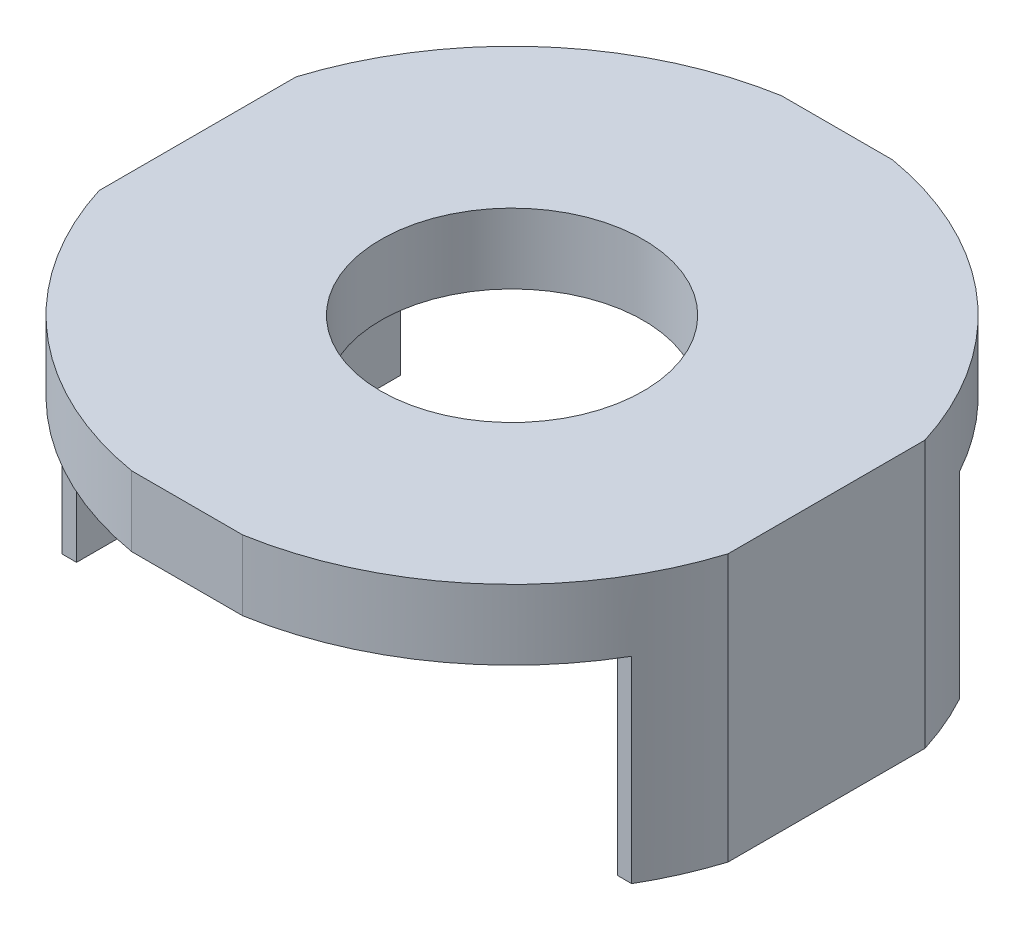
ISO-10303-21;
HEADER;
FILE_DESCRIPTION(('STEP AP214'),'2;1');
FILE_NAME('part.step','',(''),(''),'','','');
FILE_SCHEMA(('AUTOMOTIVE_DESIGN { 1 0 10303 214 1 1 1 1 }'));
ENDSEC;
DATA;
#1=APPLICATION_CONTEXT('core data for automotive mechanical design processes');
#2=APPLICATION_PROTOCOL_DEFINITION('international standard','automotive_design',2000,#1);
#3=PRODUCT_CONTEXT('',#1,'mechanical');
#4=PRODUCT('Part','Part','',(#3));
#5=PRODUCT_RELATED_PRODUCT_CATEGORY('part','',(#4));
#6=PRODUCT_DEFINITION_FORMATION('','',#4);
#7=PRODUCT_DEFINITION_CONTEXT('part definition',#1,'design');
#8=PRODUCT_DEFINITION('design','',#6,#7);
#9=PRODUCT_DEFINITION_SHAPE('','',#8);
#10=(LENGTH_UNIT() NAMED_UNIT(*) SI_UNIT(.MILLI.,.METRE.));
#11=(NAMED_UNIT(*) PLANE_ANGLE_UNIT() SI_UNIT($,.RADIAN.));
#12=(NAMED_UNIT(*) SI_UNIT($,.STERADIAN.) SOLID_ANGLE_UNIT());
#13=UNCERTAINTY_MEASURE_WITH_UNIT(LENGTH_MEASURE(1.E-05),#10,'distance_accuracy_value','');
#14=(GEOMETRIC_REPRESENTATION_CONTEXT(3) GLOBAL_UNCERTAINTY_ASSIGNED_CONTEXT((#13)) GLOBAL_UNIT_ASSIGNED_CONTEXT((#10,
#11,#12)) REPRESENTATION_CONTEXT('',''));
#15=CARTESIAN_POINT('',(0.,0.,0.));
#16=DIRECTION('',(0.,0.,1.));
#17=DIRECTION('',(1.,0.,0.));
#18=AXIS2_PLACEMENT_3D('',#15,#16,#17);
#19=CARTESIAN_POINT('',(0.,0.,0.));
#20=DIRECTION('',(0.,1.,0.));
#21=DIRECTION('',(0.,0.,1.));
#22=AXIS2_PLACEMENT_3D('',#19,#20,#21);
#23=PLANE('',#22);
#24=CARTESIAN_POINT('',(0.,0.,0.));
#25=DIRECTION('',(0.,1.,0.));
#26=DIRECTION('',(0.,0.,1.));
#27=AXIS2_PLACEMENT_3D('',#24,#25,#26);
#28=CIRCLE('',#27,3.);
#29=CARTESIAN_POINT('',(0.,0.,3.));
#30=VERTEX_POINT('',#29);
#31=EDGE_CURVE('E195',#30,#30,#28,.T.);
#32=ORIENTED_EDGE('',*,*,#31,.T.);
#33=EDGE_LOOP('',(#32));
#34=FACE_BOUND('',#33,.T.);
#35=DIRECTION('',(1.,0.,0.));
#36=VECTOR('',#35,1.);
#37=CARTESIAN_POINT('',(0.,0.,-3.63578831627872));
#38=LINE('',#37,#36);
#39=CARTESIAN_POINT('',(-6.59408396361551,0.,-3.63578831627872));
#40=VERTEX_POINT('',#39);
#41=CARTESIAN_POINT('',(-6.18598636235834,0.,-3.63578831627872));
#42=VERTEX_POINT('',#41);
#43=EDGE_CURVE('E220',#40,#42,#38,.T.);
#44=ORIENTED_EDGE('',*,*,#43,.F.);
#45=CARTESIAN_POINT('',(0.,0.,0.));
#46=DIRECTION('',(0.,1.,0.));
#47=DIRECTION('',(0.,0.,1.));
#48=AXIS2_PLACEMENT_3D('',#45,#46,#47);
#49=CIRCLE('',#48,7.53);
#50=CARTESIAN_POINT('',(-1.26824843861214,0.,-7.42242857142848));
#51=VERTEX_POINT('',#50);
#52=EDGE_CURVE('E141',#51,#40,#49,.T.);
#53=ORIENTED_EDGE('',*,*,#52,.F.);
#54=DIRECTION('',(-1.,0.,0.));
#55=VECTOR('',#54,1.);
#56=CARTESIAN_POINT('',(-1.26824843861214,0.,-7.42242857142848));
#57=LINE('',#56,#55);
#58=CARTESIAN_POINT('',(1.26824843861214,0.,-7.42242857142848));
#59=VERTEX_POINT('',#58);
#60=EDGE_CURVE('E80',#59,#51,#57,.T.);
#61=ORIENTED_EDGE('',*,*,#60,.F.);
#62=CARTESIAN_POINT('',(0.,0.,0.));
#63=DIRECTION('',(0.,1.,0.));
#64=DIRECTION('',(0.,0.,1.));
#65=AXIS2_PLACEMENT_3D('',#62,#63,#64);
#66=CIRCLE('',#65,7.53);
#67=CARTESIAN_POINT('',(6.60275837824071,0.,-3.62001129812769));
#68=VERTEX_POINT('',#67);
#69=EDGE_CURVE('E138',#68,#59,#66,.T.);
#70=ORIENTED_EDGE('',*,*,#69,.F.);
#71=DIRECTION('',(1.,0.,0.));
#72=VECTOR('',#71,1.);
#73=CARTESIAN_POINT('',(0.,0.,-3.62001129812769));
#74=LINE('',#73,#72);
#75=CARTESIAN_POINT('',(6.18598636235834,0.,-3.62001129812769));
#76=VERTEX_POINT('',#75);
#77=EDGE_CURVE('E173',#76,#68,#74,.T.);
#78=ORIENTED_EDGE('',*,*,#77,.F.);
#79=DIRECTION('',(0.,0.,1.));
#80=VECTOR('',#79,1.);
#81=CARTESIAN_POINT('',(6.18598636235834,0.,0.));
#82=LINE('',#81,#80);
#83=CARTESIAN_POINT('',(6.18598636235834,0.,3.77998870187231));
#84=VERTEX_POINT('',#83);
#85=EDGE_CURVE('E168',#76,#84,#82,.T.);
#86=ORIENTED_EDGE('',*,*,#85,.T.);
#87=DIRECTION('',(1.,0.,0.));
#88=VECTOR('',#87,1.);
#89=CARTESIAN_POINT('',(0.,0.,3.77998870187231));
#90=LINE('',#89,#88);
#91=CARTESIAN_POINT('',(6.51249456151156,0.,3.77998870187231));
#92=VERTEX_POINT('',#91);
#93=EDGE_CURVE('E49',#84,#92,#90,.T.);
#94=ORIENTED_EDGE('',*,*,#93,.T.);
#95=CARTESIAN_POINT('',(0.,0.,0.));
#96=DIRECTION('',(0.,1.,0.));
#97=DIRECTION('',(0.,0.,1.));
#98=AXIS2_PLACEMENT_3D('',#95,#96,#97);
#99=CIRCLE('',#98,7.53);
#100=CARTESIAN_POINT('',(1.26824843861214,0.,7.42242857142848));
#101=VERTEX_POINT('',#100);
#102=EDGE_CURVE('E135',#101,#92,#99,.T.);
#103=ORIENTED_EDGE('',*,*,#102,.F.);
#104=DIRECTION('',(1.,0.,0.));
#105=VECTOR('',#104,1.);
#106=CARTESIAN_POINT('',(1.26824843861214,0.,7.42242857142848));
#107=LINE('',#106,#105);
#108=CARTESIAN_POINT('',(-1.26824843861214,0.,7.42242857142848));
#109=VERTEX_POINT('',#108);
#110=EDGE_CURVE('E132',#109,#101,#107,.T.);
#111=ORIENTED_EDGE('',*,*,#110,.F.);
#112=CARTESIAN_POINT('',(0.,0.,0.));
#113=DIRECTION('',(0.,1.,0.));
#114=DIRECTION('',(0.,0.,1.));
#115=AXIS2_PLACEMENT_3D('',#112,#113,#114);
#116=CIRCLE('',#115,7.53);
#117=CARTESIAN_POINT('',(-6.52162636158621,0.,3.76421168372128));
#118=VERTEX_POINT('',#117);
#119=EDGE_CURVE('E130',#118,#109,#116,.T.);
#120=ORIENTED_EDGE('',*,*,#119,.F.);
#121=DIRECTION('',(1.,0.,0.));
#122=VECTOR('',#121,1.);
#123=CARTESIAN_POINT('',(0.,0.,3.76421168372128));
#124=LINE('',#123,#122);
#125=CARTESIAN_POINT('',(-6.18598636235834,0.,3.76421168372128));
#126=VERTEX_POINT('',#125);
#127=EDGE_CURVE('E272',#118,#126,#124,.T.);
#128=ORIENTED_EDGE('',*,*,#127,.T.);
#129=DIRECTION('',(0.,0.,1.));
#130=VECTOR('',#129,1.);
#131=CARTESIAN_POINT('',(-6.18598636235834,0.,0.));
#132=LINE('',#131,#130);
#133=EDGE_CURVE('E276',#42,#126,#132,.T.);
#134=ORIENTED_EDGE('',*,*,#133,.F.);
#135=EDGE_LOOP('',(#44,#53,#61,#70,#78,#86,#94,#103,#111,#120,#128,#134));
#136=FACE_BOUND('',#135,.T.);
#137=ADVANCED_FACE('F34',(#34,#136),#23,.F.);
#138=CARTESIAN_POINT('',(0.,1.6,0.));
#139=DIRECTION('',(0.,1.,0.));
#140=DIRECTION('',(0.,0.,1.));
#141=AXIS2_PLACEMENT_3D('',#138,#139,#140);
#142=PLANE('',#141);
#143=CARTESIAN_POINT('',(0.,1.6,0.));
#144=DIRECTION('',(0.,1.,0.));
#145=DIRECTION('',(0.,0.,1.));
#146=AXIS2_PLACEMENT_3D('',#143,#144,#145);
#147=CIRCLE('',#146,7.53);
#148=CARTESIAN_POINT('',(-7.18598636235834,1.6,2.25));
#149=VERTEX_POINT('',#148);
#150=CARTESIAN_POINT('',(-1.26824843861214,1.6,7.42242857142848));
#151=VERTEX_POINT('',#150);
#152=EDGE_CURVE('E143',#149,#151,#147,.T.);
#153=ORIENTED_EDGE('',*,*,#152,.T.);
#154=DIRECTION('',(1.,0.,0.));
#155=VECTOR('',#154,1.);
#156=CARTESIAN_POINT('',(1.26824843861214,1.6,7.42242857142848));
#157=LINE('',#156,#155);
#158=CARTESIAN_POINT('',(1.26824843861214,1.6,7.42242857142848));
#159=VERTEX_POINT('',#158);
#160=EDGE_CURVE('E88',#151,#159,#157,.T.);
#161=ORIENTED_EDGE('',*,*,#160,.T.);
#162=CARTESIAN_POINT('',(0.,1.6,0.));
#163=DIRECTION('',(0.,1.,0.));
#164=DIRECTION('',(0.,0.,1.));
#165=AXIS2_PLACEMENT_3D('',#162,#163,#164);
#166=CIRCLE('',#165,7.53);
#167=CARTESIAN_POINT('',(7.18598636235834,1.6,2.25));
#168=VERTEX_POINT('',#167);
#169=EDGE_CURVE('E160',#159,#168,#166,.T.);
#170=ORIENTED_EDGE('',*,*,#169,.T.);
#171=DIRECTION('',(0.,0.,-1.));
#172=VECTOR('',#171,1.);
#173=CARTESIAN_POINT('',(7.18598636235834,1.6,2.25));
#174=LINE('',#173,#172);
#175=CARTESIAN_POINT('',(7.18598636235834,1.6,-2.25));
#176=VERTEX_POINT('',#175);
#177=EDGE_CURVE('E203',#168,#176,#174,.T.);
#178=ORIENTED_EDGE('',*,*,#177,.T.);
#179=CARTESIAN_POINT('',(0.,1.6,0.));
#180=DIRECTION('',(0.,1.,0.));
#181=DIRECTION('',(0.,0.,1.));
#182=AXIS2_PLACEMENT_3D('',#179,#180,#181);
#183=CIRCLE('',#182,7.53);
#184=CARTESIAN_POINT('',(1.26824843861214,1.6,-7.42242857142848));
#185=VERTEX_POINT('',#184);
#186=EDGE_CURVE('E111',#176,#185,#183,.T.);
#187=ORIENTED_EDGE('',*,*,#186,.T.);
#188=DIRECTION('',(-1.,0.,0.));
#189=VECTOR('',#188,1.);
#190=CARTESIAN_POINT('',(-1.26824843861214,1.6,-7.42242857142848));
#191=LINE('',#190,#189);
#192=CARTESIAN_POINT('',(-1.26824843861214,1.6,-7.42242857142848));
#193=VERTEX_POINT('',#192);
#194=EDGE_CURVE('E104',#185,#193,#191,.T.);
#195=ORIENTED_EDGE('',*,*,#194,.T.);
#196=CARTESIAN_POINT('',(0.,1.6,0.));
#197=DIRECTION('',(0.,1.,0.));
#198=DIRECTION('',(0.,0.,1.));
#199=AXIS2_PLACEMENT_3D('',#196,#197,#198);
#200=CIRCLE('',#199,7.53);
#201=CARTESIAN_POINT('',(-7.18598636235834,1.6,-2.25));
#202=VERTEX_POINT('',#201);
#203=EDGE_CURVE('E108',#193,#202,#200,.T.);
#204=ORIENTED_EDGE('',*,*,#203,.T.);
#205=DIRECTION('',(0.,0.,1.));
#206=VECTOR('',#205,1.);
#207=CARTESIAN_POINT('',(-7.18598636235834,1.6,2.25));
#208=LINE('',#207,#206);
#209=EDGE_CURVE('E58',#202,#149,#208,.T.);
#210=ORIENTED_EDGE('',*,*,#209,.T.);
#211=EDGE_LOOP('',(#153,#161,#170,#178,#187,#195,#204,#210));
#212=FACE_BOUND('',#211,.T.);
#213=CARTESIAN_POINT('',(0.,1.6,0.));
#214=DIRECTION('',(0.,1.,0.));
#215=DIRECTION('',(0.,0.,1.));
#216=AXIS2_PLACEMENT_3D('',#213,#214,#215);
#217=CIRCLE('',#216,3.);
#218=CARTESIAN_POINT('',(0.,1.6,3.));
#219=VERTEX_POINT('',#218);
#220=EDGE_CURVE('E133',#219,#219,#217,.T.);
#221=ORIENTED_EDGE('',*,*,#220,.F.);
#222=EDGE_LOOP('',(#221));
#223=FACE_BOUND('',#222,.T.);
#224=ADVANCED_FACE('F105',(#212,#223),#142,.T.);
#225=CARTESIAN_POINT('',(0.,1.6,0.));
#226=DIRECTION('',(0.,-1.,0.));
#227=DIRECTION('',(0.,0.,-1.));
#228=AXIS2_PLACEMENT_3D('',#225,#226,#227);
#229=CYLINDRICAL_SURFACE('',#228,7.53);
#230=DIRECTION('',(0.,-1.,0.));
#231=VECTOR('',#230,1.);
#232=CARTESIAN_POINT('',(-7.18598636235834,1.6,2.25));
#233=LINE('',#232,#231);
#234=CARTESIAN_POINT('',(-7.18598636235834,-4.5,2.25));
#235=VERTEX_POINT('',#234);
#236=EDGE_CURVE('E126',#149,#235,#233,.T.);
#237=ORIENTED_EDGE('',*,*,#236,.T.);
#238=CARTESIAN_POINT('',(0.,-4.5,0.));
#239=DIRECTION('',(0.,-1.,0.));
#240=DIRECTION('',(0.,0.,-1.));
#241=AXIS2_PLACEMENT_3D('',#238,#239,#240);
#242=CIRCLE('',#241,7.53);
#243=CARTESIAN_POINT('',(-6.52162636158621,-4.5,3.76421168372128));
#244=VERTEX_POINT('',#243);
#245=EDGE_CURVE('E285',#244,#235,#242,.T.);
#246=ORIENTED_EDGE('',*,*,#245,.F.);
#247=DIRECTION('',(0.,1.,0.));
#248=VECTOR('',#247,1.);
#249=CARTESIAN_POINT('',(-6.52162636158621,-4.5,3.76421168372128));
#250=LINE('',#249,#248);
#251=EDGE_CURVE('E268',#244,#118,#250,.T.);
#252=ORIENTED_EDGE('',*,*,#251,.T.);
#253=ORIENTED_EDGE('',*,*,#119,.T.);
#254=DIRECTION('',(0.,-1.,0.));
#255=VECTOR('',#254,1.);
#256=CARTESIAN_POINT('',(-1.26824843861214,1.6,7.42242857142848));
#257=LINE('',#256,#255);
#258=EDGE_CURVE('E11',#151,#109,#257,.T.);
#259=ORIENTED_EDGE('',*,*,#258,.F.);
#260=ORIENTED_EDGE('',*,*,#152,.F.);
#261=EDGE_LOOP('',(#237,#246,#252,#253,#259,#260));
#262=FACE_BOUND('',#261,.T.);
#263=ADVANCED_FACE('F36',(#262),#229,.T.);
#264=CARTESIAN_POINT('',(1.26824843861214,1.6,7.42242857142848));
#265=DIRECTION('',(0.,0.,-1.));
#266=DIRECTION('',(-1.,0.,0.));
#267=AXIS2_PLACEMENT_3D('',#264,#265,#266);
#268=PLANE('',#267);
#269=ORIENTED_EDGE('',*,*,#110,.T.);
#270=DIRECTION('',(0.,-1.,0.));
#271=VECTOR('',#270,1.);
#272=CARTESIAN_POINT('',(1.26824843861214,1.6,7.42242857142848));
#273=LINE('',#272,#271);
#274=EDGE_CURVE('E42',#159,#101,#273,.T.);
#275=ORIENTED_EDGE('',*,*,#274,.F.);
#276=ORIENTED_EDGE('',*,*,#160,.F.);
#277=ORIENTED_EDGE('',*,*,#258,.T.);
#278=EDGE_LOOP('',(#269,#275,#276,#277));
#279=FACE_BOUND('',#278,.T.);
#280=ADVANCED_FACE('F324',(#279),#268,.F.);
#281=CARTESIAN_POINT('',(0.,1.6,0.));
#282=DIRECTION('',(0.,-1.,0.));
#283=DIRECTION('',(0.,0.,-1.));
#284=AXIS2_PLACEMENT_3D('',#281,#282,#283);
#285=CYLINDRICAL_SURFACE('',#284,7.53);
#286=ORIENTED_EDGE('',*,*,#102,.T.);
#287=DIRECTION('',(0.,1.,0.));
#288=VECTOR('',#287,1.);
#289=CARTESIAN_POINT('',(6.51249456151156,-4.5,3.77998870187231));
#290=LINE('',#289,#288);
#291=CARTESIAN_POINT('',(6.51249456151156,-4.5,3.77998870187231));
#292=VERTEX_POINT('',#291);
#293=EDGE_CURVE('E185',#292,#92,#290,.T.);
#294=ORIENTED_EDGE('',*,*,#293,.F.);
#295=CARTESIAN_POINT('',(0.,-4.5,0.));
#296=DIRECTION('',(0.,-1.,0.));
#297=DIRECTION('',(0.,0.,-1.));
#298=AXIS2_PLACEMENT_3D('',#295,#296,#297);
#299=CIRCLE('',#298,7.53);
#300=CARTESIAN_POINT('',(7.18598636235834,-4.5,2.25));
#301=VERTEX_POINT('',#300);
#302=EDGE_CURVE('E179',#301,#292,#299,.T.);
#303=ORIENTED_EDGE('',*,*,#302,.F.);
#304=DIRECTION('',(0.,-1.,0.));
#305=VECTOR('',#304,1.);
#306=CARTESIAN_POINT('',(7.18598636235834,1.6,2.25));
#307=LINE('',#306,#305);
#308=EDGE_CURVE('E151',#168,#301,#307,.T.);
#309=ORIENTED_EDGE('',*,*,#308,.F.);
#310=ORIENTED_EDGE('',*,*,#169,.F.);
#311=ORIENTED_EDGE('',*,*,#274,.T.);
#312=EDGE_LOOP('',(#286,#294,#303,#309,#310,#311));
#313=FACE_BOUND('',#312,.T.);
#314=ADVANCED_FACE('F157',(#313),#285,.T.);
#315=CARTESIAN_POINT('',(7.18598636235834,1.6,2.25));
#316=DIRECTION('',(-1.,0.,0.));
#317=DIRECTION('',(0.,0.,1.));
#318=AXIS2_PLACEMENT_3D('',#315,#316,#317);
#319=PLANE('',#318);
#320=ORIENTED_EDGE('',*,*,#308,.T.);
#321=DIRECTION('',(0.,0.,1.));
#322=VECTOR('',#321,1.);
#323=CARTESIAN_POINT('',(7.18598636235834,-4.5,0.));
#324=LINE('',#323,#322);
#325=CARTESIAN_POINT('',(7.18598636235834,-4.5,-2.25));
#326=VERTEX_POINT('',#325);
#327=EDGE_CURVE('E211',#326,#301,#324,.T.);
#328=ORIENTED_EDGE('',*,*,#327,.F.);
#329=DIRECTION('',(0.,-1.,0.));
#330=VECTOR('',#329,1.);
#331=CARTESIAN_POINT('',(7.18598636235834,1.6,-2.25));
#332=LINE('',#331,#330);
#333=EDGE_CURVE('E148',#176,#326,#332,.T.);
#334=ORIENTED_EDGE('',*,*,#333,.F.);
#335=ORIENTED_EDGE('',*,*,#177,.F.);
#336=EDGE_LOOP('',(#320,#328,#334,#335));
#337=FACE_BOUND('',#336,.T.);
#338=ADVANCED_FACE('F208',(#337),#319,.F.);
#339=CARTESIAN_POINT('',(0.,1.6,0.));
#340=DIRECTION('',(0.,-1.,0.));
#341=DIRECTION('',(0.,0.,-1.));
#342=AXIS2_PLACEMENT_3D('',#339,#340,#341);
#343=CYLINDRICAL_SURFACE('',#342,7.53);
#344=ORIENTED_EDGE('',*,*,#333,.T.);
#345=CARTESIAN_POINT('',(0.,-4.5,0.));
#346=DIRECTION('',(0.,-1.,0.));
#347=DIRECTION('',(0.,0.,-1.));
#348=AXIS2_PLACEMENT_3D('',#345,#346,#347);
#349=CIRCLE('',#348,7.53);
#350=CARTESIAN_POINT('',(6.60275837824071,-4.5,-3.62001129812769));
#351=VERTEX_POINT('',#350);
#352=EDGE_CURVE('E255',#351,#326,#349,.T.);
#353=ORIENTED_EDGE('',*,*,#352,.F.);
#354=DIRECTION('',(0.,1.,0.));
#355=VECTOR('',#354,1.);
#356=CARTESIAN_POINT('',(6.60275837824071,-4.5,-3.62001129812769));
#357=LINE('',#356,#355);
#358=EDGE_CURVE('E187',#351,#68,#357,.T.);
#359=ORIENTED_EDGE('',*,*,#358,.T.);
#360=ORIENTED_EDGE('',*,*,#69,.T.);
#361=DIRECTION('',(0.,-1.,0.));
#362=VECTOR('',#361,1.);
#363=CARTESIAN_POINT('',(1.26824843861214,1.6,-7.42242857142848));
#364=LINE('',#363,#362);
#365=EDGE_CURVE('E119',#185,#59,#364,.T.);
#366=ORIENTED_EDGE('',*,*,#365,.F.);
#367=ORIENTED_EDGE('',*,*,#186,.F.);
#368=EDGE_LOOP('',(#344,#353,#359,#360,#366,#367));
#369=FACE_BOUND('',#368,.T.);
#370=ADVANCED_FACE('F215',(#369),#343,.T.);
#371=CARTESIAN_POINT('',(-1.26824843861214,1.6,-7.42242857142848));
#372=DIRECTION('',(0.,0.,1.));
#373=DIRECTION('',(1.,0.,0.));
#374=AXIS2_PLACEMENT_3D('',#371,#372,#373);
#375=PLANE('',#374);
#376=ORIENTED_EDGE('',*,*,#60,.T.);
#377=DIRECTION('',(0.,-1.,0.));
#378=VECTOR('',#377,1.);
#379=CARTESIAN_POINT('',(-1.26824843861214,1.6,-7.42242857142848));
#380=LINE('',#379,#378);
#381=EDGE_CURVE('E114',#193,#51,#380,.T.);
#382=ORIENTED_EDGE('',*,*,#381,.F.);
#383=ORIENTED_EDGE('',*,*,#194,.F.);
#384=ORIENTED_EDGE('',*,*,#365,.T.);
#385=EDGE_LOOP('',(#376,#382,#383,#384));
#386=FACE_BOUND('',#385,.T.);
#387=ADVANCED_FACE('F115',(#386),#375,.F.);
#388=CARTESIAN_POINT('',(0.,1.6,0.));
#389=DIRECTION('',(0.,-1.,0.));
#390=DIRECTION('',(0.,0.,-1.));
#391=AXIS2_PLACEMENT_3D('',#388,#389,#390);
#392=CYLINDRICAL_SURFACE('',#391,7.53);
#393=ORIENTED_EDGE('',*,*,#52,.T.);
#394=DIRECTION('',(0.,1.,0.));
#395=VECTOR('',#394,1.);
#396=CARTESIAN_POINT('',(-6.59408396361551,-4.5,-3.63578831627872));
#397=LINE('',#396,#395);
#398=CARTESIAN_POINT('',(-6.59408396361551,-4.5,-3.63578831627872));
#399=VERTEX_POINT('',#398);
#400=EDGE_CURVE('E224',#399,#40,#397,.T.);
#401=ORIENTED_EDGE('',*,*,#400,.F.);
#402=CARTESIAN_POINT('',(0.,-4.5,0.));
#403=DIRECTION('',(0.,-1.,0.));
#404=DIRECTION('',(0.,0.,-1.));
#405=AXIS2_PLACEMENT_3D('',#402,#403,#404);
#406=CIRCLE('',#405,7.53);
#407=CARTESIAN_POINT('',(-7.18598636235834,-4.5,-2.25));
#408=VERTEX_POINT('',#407);
#409=EDGE_CURVE('E271',#408,#399,#406,.T.);
#410=ORIENTED_EDGE('',*,*,#409,.F.);
#411=DIRECTION('',(0.,-1.,0.));
#412=VECTOR('',#411,1.);
#413=CARTESIAN_POINT('',(-7.18598636235834,1.6,-2.25));
#414=LINE('',#413,#412);
#415=EDGE_CURVE('E120',#202,#408,#414,.T.);
#416=ORIENTED_EDGE('',*,*,#415,.F.);
#417=ORIENTED_EDGE('',*,*,#203,.F.);
#418=ORIENTED_EDGE('',*,*,#381,.T.);
#419=EDGE_LOOP('',(#393,#401,#410,#416,#417,#418));
#420=FACE_BOUND('',#419,.T.);
#421=ADVANCED_FACE('F122',(#420),#392,.T.);
#422=CARTESIAN_POINT('',(-7.18598636235834,1.6,2.25));
#423=DIRECTION('',(1.,0.,0.));
#424=DIRECTION('',(0.,0.,-1.));
#425=AXIS2_PLACEMENT_3D('',#422,#423,#424);
#426=PLANE('',#425);
#427=ORIENTED_EDGE('',*,*,#415,.T.);
#428=DIRECTION('',(0.,0.,-1.));
#429=VECTOR('',#428,1.);
#430=CARTESIAN_POINT('',(-7.18598636235834,-4.5,0.));
#431=LINE('',#430,#429);
#432=EDGE_CURVE('E282',#235,#408,#431,.T.);
#433=ORIENTED_EDGE('',*,*,#432,.F.);
#434=ORIENTED_EDGE('',*,*,#236,.F.);
#435=ORIENTED_EDGE('',*,*,#209,.F.);
#436=EDGE_LOOP('',(#427,#433,#434,#435));
#437=FACE_BOUND('',#436,.T.);
#438=ADVANCED_FACE('F322',(#437),#426,.F.);
#439=CARTESIAN_POINT('',(0.,1.6,0.));
#440=DIRECTION('',(0.,-1.,0.));
#441=DIRECTION('',(0.,0.,-1.));
#442=AXIS2_PLACEMENT_3D('',#439,#440,#441);
#443=CYLINDRICAL_SURFACE('',#442,3.);
#444=ORIENTED_EDGE('',*,*,#220,.T.);
#445=EDGE_LOOP('',(#444));
#446=FACE_BOUND('',#445,.T.);
#447=ORIENTED_EDGE('',*,*,#31,.F.);
#448=EDGE_LOOP('',(#447));
#449=FACE_BOUND('',#448,.T.);
#450=ADVANCED_FACE('F342',(#446,#449),#443,.F.);
#451=CARTESIAN_POINT('',(0.,-4.5,3.77998870187231));
#452=DIRECTION('',(0.,0.,1.));
#453=DIRECTION('',(1.,0.,0.));
#454=AXIS2_PLACEMENT_3D('',#451,#452,#453);
#455=PLANE('',#454);
#456=ORIENTED_EDGE('',*,*,#93,.F.);
#457=DIRECTION('',(0.,1.,0.));
#458=VECTOR('',#457,1.);
#459=CARTESIAN_POINT('',(6.18598636235834,-4.5,3.77998870187231));
#460=LINE('',#459,#458);
#461=CARTESIAN_POINT('',(6.18598636235834,-4.5,3.77998870187231));
#462=VERTEX_POINT('',#461);
#463=EDGE_CURVE('E193',#462,#84,#460,.T.);
#464=ORIENTED_EDGE('',*,*,#463,.F.);
#465=DIRECTION('',(1.,0.,0.));
#466=VECTOR('',#465,1.);
#467=CARTESIAN_POINT('',(0.,-4.5,3.77998870187231));
#468=LINE('',#467,#466);
#469=EDGE_CURVE('E184',#462,#292,#468,.T.);
#470=ORIENTED_EDGE('',*,*,#469,.T.);
#471=ORIENTED_EDGE('',*,*,#293,.T.);
#472=EDGE_LOOP('',(#456,#464,#470,#471));
#473=FACE_BOUND('',#472,.T.);
#474=ADVANCED_FACE('F377',(#473),#455,.T.);
#475=CARTESIAN_POINT('',(6.18598636235834,-4.5,0.));
#476=DIRECTION('',(-1.,0.,0.));
#477=DIRECTION('',(0.,0.,1.));
#478=AXIS2_PLACEMENT_3D('',#475,#476,#477);
#479=PLANE('',#478);
#480=ORIENTED_EDGE('',*,*,#85,.F.);
#481=DIRECTION('',(0.,1.,0.));
#482=VECTOR('',#481,1.);
#483=CARTESIAN_POINT('',(6.18598636235834,-4.5,-3.62001129812769));
#484=LINE('',#483,#482);
#485=CARTESIAN_POINT('',(6.18598636235834,-4.5,-3.62001129812769));
#486=VERTEX_POINT('',#485);
#487=EDGE_CURVE('E190',#486,#76,#484,.T.);
#488=ORIENTED_EDGE('',*,*,#487,.F.);
#489=DIRECTION('',(0.,0.,1.));
#490=VECTOR('',#489,1.);
#491=CARTESIAN_POINT('',(6.18598636235834,-4.5,0.));
#492=LINE('',#491,#490);
#493=EDGE_CURVE('E259',#486,#462,#492,.T.);
#494=ORIENTED_EDGE('',*,*,#493,.T.);
#495=ORIENTED_EDGE('',*,*,#463,.T.);
#496=EDGE_LOOP('',(#480,#488,#494,#495));
#497=FACE_BOUND('',#496,.T.);
#498=ADVANCED_FACE('F383',(#497),#479,.T.);
#499=CARTESIAN_POINT('',(0.,-4.5,-3.62001129812769));
#500=DIRECTION('',(0.,0.,1.));
#501=DIRECTION('',(1.,0.,0.));
#502=AXIS2_PLACEMENT_3D('',#499,#500,#501);
#503=PLANE('',#502);
#504=ORIENTED_EDGE('',*,*,#77,.T.);
#505=ORIENTED_EDGE('',*,*,#358,.F.);
#506=DIRECTION('',(1.,0.,0.));
#507=VECTOR('',#506,1.);
#508=CARTESIAN_POINT('',(0.,-4.5,-3.62001129812769));
#509=LINE('',#508,#507);
#510=EDGE_CURVE('E257',#486,#351,#509,.T.);
#511=ORIENTED_EDGE('',*,*,#510,.F.);
#512=ORIENTED_EDGE('',*,*,#487,.T.);
#513=EDGE_LOOP('',(#504,#505,#511,#512));
#514=FACE_BOUND('',#513,.T.);
#515=ADVANCED_FACE('F253',(#514),#503,.F.);
#516=CARTESIAN_POINT('',(0.,-4.5,0.));
#517=DIRECTION('',(0.,-1.,0.));
#518=DIRECTION('',(0.,0.,-1.));
#519=AXIS2_PLACEMENT_3D('',#516,#517,#518);
#520=PLANE('',#519);
#521=ORIENTED_EDGE('',*,*,#469,.F.);
#522=ORIENTED_EDGE('',*,*,#493,.F.);
#523=ORIENTED_EDGE('',*,*,#510,.T.);
#524=ORIENTED_EDGE('',*,*,#352,.T.);
#525=ORIENTED_EDGE('',*,*,#327,.T.);
#526=ORIENTED_EDGE('',*,*,#302,.T.);
#527=EDGE_LOOP('',(#521,#522,#523,#524,#525,#526));
#528=FACE_BOUND('',#527,.T.);
#529=ADVANCED_FACE('F397',(#528),#520,.T.);
#530=CARTESIAN_POINT('',(0.,-4.5,-3.63578831627872));
#531=DIRECTION('',(0.,0.,1.));
#532=DIRECTION('',(1.,0.,0.));
#533=AXIS2_PLACEMENT_3D('',#530,#531,#532);
#534=PLANE('',#533);
#535=ORIENTED_EDGE('',*,*,#43,.T.);
#536=DIRECTION('',(0.,1.,0.));
#537=VECTOR('',#536,1.);
#538=CARTESIAN_POINT('',(-6.18598636235834,-4.5,-3.63578831627872));
#539=LINE('',#538,#537);
#540=CARTESIAN_POINT('',(-6.18598636235834,-4.5,-3.63578831627872));
#541=VERTEX_POINT('',#540);
#542=EDGE_CURVE('E171',#541,#42,#539,.T.);
#543=ORIENTED_EDGE('',*,*,#542,.F.);
#544=DIRECTION('',(1.,0.,0.));
#545=VECTOR('',#544,1.);
#546=CARTESIAN_POINT('',(0.,-4.5,-3.63578831627872));
#547=LINE('',#546,#545);
#548=EDGE_CURVE('E275',#399,#541,#547,.T.);
#549=ORIENTED_EDGE('',*,*,#548,.F.);
#550=ORIENTED_EDGE('',*,*,#400,.T.);
#551=EDGE_LOOP('',(#535,#543,#549,#550));
#552=FACE_BOUND('',#551,.T.);
#553=ADVANCED_FACE('F300',(#552),#534,.F.);
#554=CARTESIAN_POINT('',(-6.18598636235834,-4.5,0.));
#555=DIRECTION('',(-1.,0.,0.));
#556=DIRECTION('',(0.,0.,1.));
#557=AXIS2_PLACEMENT_3D('',#554,#555,#556);
#558=PLANE('',#557);
#559=ORIENTED_EDGE('',*,*,#133,.T.);
#560=DIRECTION('',(0.,1.,0.));
#561=VECTOR('',#560,1.);
#562=CARTESIAN_POINT('',(-6.18598636235834,-4.5,3.76421168372128));
#563=LINE('',#562,#561);
#564=CARTESIAN_POINT('',(-6.18598636235834,-4.5,3.76421168372128));
#565=VERTEX_POINT('',#564);
#566=EDGE_CURVE('E176',#565,#126,#563,.T.);
#567=ORIENTED_EDGE('',*,*,#566,.F.);
#568=DIRECTION('',(0.,0.,1.));
#569=VECTOR('',#568,1.);
#570=CARTESIAN_POINT('',(-6.18598636235834,-4.5,0.));
#571=LINE('',#570,#569);
#572=EDGE_CURVE('E291',#541,#565,#571,.T.);
#573=ORIENTED_EDGE('',*,*,#572,.F.);
#574=ORIENTED_EDGE('',*,*,#542,.T.);
#575=EDGE_LOOP('',(#559,#567,#573,#574));
#576=FACE_BOUND('',#575,.T.);
#577=ADVANCED_FACE('F303',(#576),#558,.F.);
#578=CARTESIAN_POINT('',(0.,-4.5,3.76421168372128));
#579=DIRECTION('',(0.,0.,1.));
#580=DIRECTION('',(1.,0.,0.));
#581=AXIS2_PLACEMENT_3D('',#578,#579,#580);
#582=PLANE('',#581);
#583=ORIENTED_EDGE('',*,*,#127,.F.);
#584=ORIENTED_EDGE('',*,*,#251,.F.);
#585=DIRECTION('',(1.,0.,0.));
#586=VECTOR('',#585,1.);
#587=CARTESIAN_POINT('',(0.,-4.5,3.76421168372128));
#588=LINE('',#587,#586);
#589=EDGE_CURVE('E288',#244,#565,#588,.T.);
#590=ORIENTED_EDGE('',*,*,#589,.T.);
#591=ORIENTED_EDGE('',*,*,#566,.T.);
#592=EDGE_LOOP('',(#583,#584,#590,#591));
#593=FACE_BOUND('',#592,.T.);
#594=ADVANCED_FACE('F317',(#593),#582,.T.);
#595=CARTESIAN_POINT('',(0.,-4.5,0.));
#596=DIRECTION('',(0.,-1.,0.));
#597=DIRECTION('',(0.,0.,-1.));
#598=AXIS2_PLACEMENT_3D('',#595,#596,#597);
#599=PLANE('',#598);
#600=ORIENTED_EDGE('',*,*,#548,.T.);
#601=ORIENTED_EDGE('',*,*,#572,.T.);
#602=ORIENTED_EDGE('',*,*,#589,.F.);
#603=ORIENTED_EDGE('',*,*,#245,.T.);
#604=ORIENTED_EDGE('',*,*,#432,.T.);
#605=ORIENTED_EDGE('',*,*,#409,.T.);
#606=EDGE_LOOP('',(#600,#601,#602,#603,#604,#605));
#607=FACE_BOUND('',#606,.T.);
#608=ADVANCED_FACE('F297',(#607),#599,.T.);
#609=CLOSED_SHELL('',(#137,#224,#263,#280,#314,#338,#370,#387,#421,#438,#450,#474,#498,#515,
#529,#553,#577,#594,#608));
#610=MANIFOLD_SOLID_BREP('B2',#609);
#611=ADVANCED_BREP_SHAPE_REPRESENTATION('',(#18,#610),#14);
#612=SHAPE_DEFINITION_REPRESENTATION(#9,#611);
ENDSEC;
END-ISO-10303-21;
